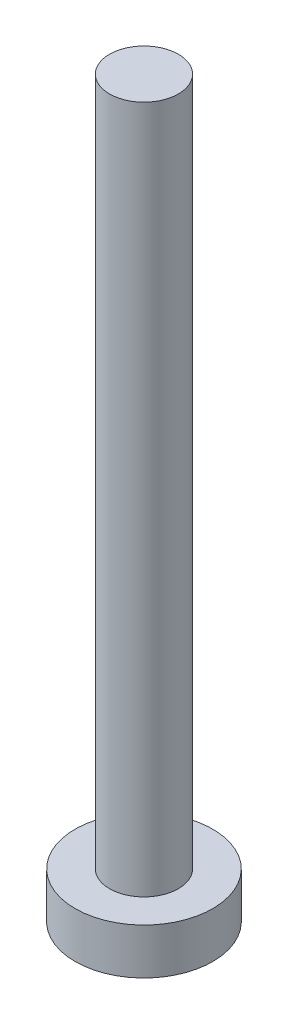
ISO-10303-21;
HEADER;
FILE_DESCRIPTION(('STEP AP214'),'2;1');
FILE_NAME('part.step','',(''),(''),'','','');
FILE_SCHEMA(('AUTOMOTIVE_DESIGN { 1 0 10303 214 1 1 1 1 }'));
ENDSEC;
DATA;
#1=APPLICATION_CONTEXT('core data for automotive mechanical design processes');
#2=APPLICATION_PROTOCOL_DEFINITION('international standard','automotive_design',2000,#1);
#3=PRODUCT_CONTEXT('',#1,'mechanical');
#4=PRODUCT('Part','Part','',(#3));
#5=PRODUCT_RELATED_PRODUCT_CATEGORY('part','',(#4));
#6=PRODUCT_DEFINITION_FORMATION('','',#4);
#7=PRODUCT_DEFINITION_CONTEXT('part definition',#1,'design');
#8=PRODUCT_DEFINITION('design','',#6,#7);
#9=PRODUCT_DEFINITION_SHAPE('','',#8);
#10=(LENGTH_UNIT() NAMED_UNIT(*) SI_UNIT(.MILLI.,.METRE.));
#11=(NAMED_UNIT(*) PLANE_ANGLE_UNIT() SI_UNIT($,.RADIAN.));
#12=(NAMED_UNIT(*) SI_UNIT($,.STERADIAN.) SOLID_ANGLE_UNIT());
#13=UNCERTAINTY_MEASURE_WITH_UNIT(LENGTH_MEASURE(1.E-05),#10,'distance_accuracy_value','');
#14=(GEOMETRIC_REPRESENTATION_CONTEXT(3) GLOBAL_UNCERTAINTY_ASSIGNED_CONTEXT((#13)) GLOBAL_UNIT_ASSIGNED_CONTEXT((#10,
#11,#12)) REPRESENTATION_CONTEXT('',''));
#15=CARTESIAN_POINT('',(0.,0.,0.));
#16=DIRECTION('',(0.,0.,1.));
#17=DIRECTION('',(1.,0.,0.));
#18=AXIS2_PLACEMENT_3D('',#15,#16,#17);
#19=CARTESIAN_POINT('',(0.,30.,0.));
#20=DIRECTION('',(0.,-1.,0.));
#21=DIRECTION('',(0.,0.,-1.));
#22=AXIS2_PLACEMENT_3D('',#19,#20,#21);
#23=CYLINDRICAL_SURFACE('',#22,1.5);
#24=CARTESIAN_POINT('',(0.,30.,0.));
#25=DIRECTION('',(0.,1.,0.));
#26=DIRECTION('',(0.,0.,1.));
#27=AXIS2_PLACEMENT_3D('',#24,#25,#26);
#28=CIRCLE('',#27,1.5);
#29=CARTESIAN_POINT('',(0.,30.,1.5));
#30=VERTEX_POINT('',#29);
#31=EDGE_CURVE('E10',#30,#30,#28,.T.);
#32=ORIENTED_EDGE('',*,*,#31,.F.);
#33=EDGE_LOOP('',(#32));
#34=FACE_BOUND('',#33,.T.);
#35=CARTESIAN_POINT('',(0.,0.,0.));
#36=DIRECTION('',(0.,1.,0.));
#37=DIRECTION('',(0.,0.,1.));
#38=AXIS2_PLACEMENT_3D('',#35,#36,#37);
#39=CIRCLE('',#38,1.5);
#40=CARTESIAN_POINT('',(0.,0.,1.5));
#41=VERTEX_POINT('',#40);
#42=EDGE_CURVE('E46',#41,#41,#39,.T.);
#43=ORIENTED_EDGE('',*,*,#42,.T.);
#44=EDGE_LOOP('',(#43));
#45=FACE_BOUND('',#44,.T.);
#46=ADVANCED_FACE('F43',(#34,#45),#23,.T.);
#47=CARTESIAN_POINT('',(0.,30.,0.));
#48=DIRECTION('',(0.,1.,0.));
#49=DIRECTION('',(0.,0.,1.));
#50=AXIS2_PLACEMENT_3D('',#47,#48,#49);
#51=PLANE('',#50);
#52=ORIENTED_EDGE('',*,*,#31,.T.);
#53=EDGE_LOOP('',(#52));
#54=FACE_BOUND('',#53,.T.);
#55=ADVANCED_FACE('F78',(#54),#51,.T.);
#56=CARTESIAN_POINT('',(0.,-2.,0.));
#57=DIRECTION('',(0.,1.,0.));
#58=DIRECTION('',(0.,0.,1.));
#59=AXIS2_PLACEMENT_3D('',#56,#57,#58);
#60=CYLINDRICAL_SURFACE('',#59,3.);
#61=CARTESIAN_POINT('',(0.,-2.,0.));
#62=DIRECTION('',(0.,1.,0.));
#63=DIRECTION('',(0.,0.,1.));
#64=AXIS2_PLACEMENT_3D('',#61,#62,#63);
#65=CIRCLE('',#64,3.);
#66=CARTESIAN_POINT('',(0.,-2.,3.));
#67=VERTEX_POINT('',#66);
#68=EDGE_CURVE('E55',#67,#67,#65,.T.);
#69=ORIENTED_EDGE('',*,*,#68,.T.);
#70=EDGE_LOOP('',(#69));
#71=FACE_BOUND('',#70,.T.);
#72=CARTESIAN_POINT('',(0.,0.,0.));
#73=DIRECTION('',(0.,1.,0.));
#74=DIRECTION('',(0.,0.,1.));
#75=AXIS2_PLACEMENT_3D('',#72,#73,#74);
#76=CIRCLE('',#75,3.);
#77=CARTESIAN_POINT('',(0.,0.,3.));
#78=VERTEX_POINT('',#77);
#79=EDGE_CURVE('E57',#78,#78,#76,.T.);
#80=ORIENTED_EDGE('',*,*,#79,.F.);
#81=EDGE_LOOP('',(#80));
#82=FACE_BOUND('',#81,.T.);
#83=ADVANCED_FACE('F65',(#71,#82),#60,.T.);
#84=CARTESIAN_POINT('',(0.,-2.,0.));
#85=DIRECTION('',(0.,1.,0.));
#86=DIRECTION('',(0.,0.,1.));
#87=AXIS2_PLACEMENT_3D('',#84,#85,#86);
#88=PLANE('',#87);
#89=ORIENTED_EDGE('',*,*,#68,.F.);
#90=EDGE_LOOP('',(#89));
#91=FACE_BOUND('',#90,.T.);
#92=ADVANCED_FACE('F68',(#91),#88,.F.);
#93=CARTESIAN_POINT('',(0.,0.,0.));
#94=DIRECTION('',(0.,1.,0.));
#95=DIRECTION('',(0.,0.,1.));
#96=AXIS2_PLACEMENT_3D('',#93,#94,#95);
#97=PLANE('',#96);
#98=ORIENTED_EDGE('',*,*,#42,.F.);
#99=EDGE_LOOP('',(#98));
#100=FACE_BOUND('',#99,.T.);
#101=ORIENTED_EDGE('',*,*,#79,.T.);
#102=EDGE_LOOP('',(#101));
#103=FACE_BOUND('',#102,.T.);
#104=ADVANCED_FACE('F70',(#100,#103),#97,.T.);
#105=CLOSED_SHELL('',(#46,#55,#83,#92,#104));
#106=MANIFOLD_SOLID_BREP('B2',#105);
#107=ADVANCED_BREP_SHAPE_REPRESENTATION('',(#18,#106),#14);
#108=SHAPE_DEFINITION_REPRESENTATION(#9,#107);
ENDSEC;
END-ISO-10303-21;
